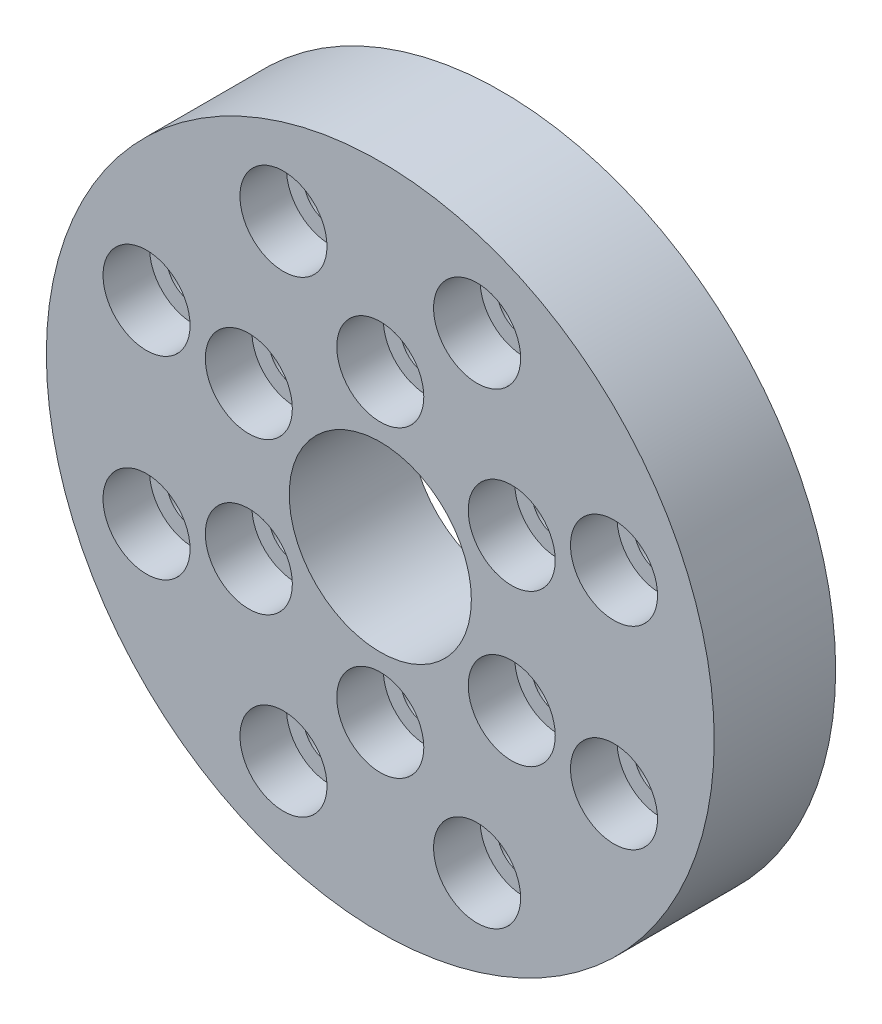
ISO-10303-21;
HEADER;
FILE_DESCRIPTION(('STEP AP214'),'2;1');
FILE_NAME('part.step','',(''),(''),'','','');
FILE_SCHEMA(('AUTOMOTIVE_DESIGN { 1 0 10303 214 1 1 1 1 }'));
ENDSEC;
DATA;
#1=APPLICATION_CONTEXT('core data for automotive mechanical design processes');
#2=APPLICATION_PROTOCOL_DEFINITION('international standard','automotive_design',2000,#1);
#3=PRODUCT_CONTEXT('',#1,'mechanical');
#4=PRODUCT('Part','Part','',(#3));
#5=PRODUCT_RELATED_PRODUCT_CATEGORY('part','',(#4));
#6=PRODUCT_DEFINITION_FORMATION('','',#4);
#7=PRODUCT_DEFINITION_CONTEXT('part definition',#1,'design');
#8=PRODUCT_DEFINITION('design','',#6,#7);
#9=PRODUCT_DEFINITION_SHAPE('','',#8);
#10=(LENGTH_UNIT() NAMED_UNIT(*) SI_UNIT(.MILLI.,.METRE.));
#11=(NAMED_UNIT(*) PLANE_ANGLE_UNIT() SI_UNIT($,.RADIAN.));
#12=(NAMED_UNIT(*) SI_UNIT($,.STERADIAN.) SOLID_ANGLE_UNIT());
#13=UNCERTAINTY_MEASURE_WITH_UNIT(LENGTH_MEASURE(1.E-05),#10,'distance_accuracy_value','');
#14=(GEOMETRIC_REPRESENTATION_CONTEXT(3) GLOBAL_UNCERTAINTY_ASSIGNED_CONTEXT((#13)) GLOBAL_UNIT_ASSIGNED_CONTEXT((#10,
#11,#12)) REPRESENTATION_CONTEXT('',''));
#15=CARTESIAN_POINT('',(0.,0.,0.));
#16=DIRECTION('',(0.,0.,1.));
#17=DIRECTION('',(1.,0.,0.));
#18=AXIS2_PLACEMENT_3D('',#15,#16,#17);
#19=CARTESIAN_POINT('',(0.,0.,6.));
#20=DIRECTION('',(0.,0.,1.));
#21=DIRECTION('',(1.,0.,0.));
#22=AXIS2_PLACEMENT_3D('',#19,#20,#21);
#23=PLANE('',#22);
#24=CARTESIAN_POINT('',(-11.548494156391,4.78354290456375,6.));
#25=DIRECTION('',(0.,0.,1.));
#26=DIRECTION('',(1.,0.,0.));
#27=AXIS2_PLACEMENT_3D('',#24,#25,#26);
#28=CIRCLE('',#27,2.15);
#29=CARTESIAN_POINT('',(-9.39849415639103,4.78354290456375,6.));
#30=VERTEX_POINT('',#29);
#31=EDGE_CURVE('E216',#30,#30,#28,.T.);
#32=ORIENTED_EDGE('',*,*,#31,.F.);
#33=EDGE_LOOP('',(#32));
#34=FACE_BOUND('',#33,.T.);
#35=CARTESIAN_POINT('',(-11.5484941563911,-4.78354290456351,6.));
#36=DIRECTION('',(0.,0.,1.));
#37=DIRECTION('',(1.,0.,0.));
#38=AXIS2_PLACEMENT_3D('',#35,#36,#37);
#39=CIRCLE('',#38,2.15);
#40=CARTESIAN_POINT('',(-9.39849415639114,-4.78354290456351,6.));
#41=VERTEX_POINT('',#40);
#42=EDGE_CURVE('E204',#41,#41,#39,.T.);
#43=ORIENTED_EDGE('',*,*,#42,.F.);
#44=EDGE_LOOP('',(#43));
#45=FACE_BOUND('',#44,.T.);
#46=CARTESIAN_POINT('',(-4.78354290456372,-11.548494156391,6.));
#47=DIRECTION('',(0.,0.,1.));
#48=DIRECTION('',(1.,0.,0.));
#49=AXIS2_PLACEMENT_3D('',#46,#47,#48);
#50=CIRCLE('',#49,2.15);
#51=CARTESIAN_POINT('',(-2.63354290456372,-11.548494156391,6.));
#52=VERTEX_POINT('',#51);
#53=EDGE_CURVE('E192',#52,#52,#50,.T.);
#54=ORIENTED_EDGE('',*,*,#53,.F.);
#55=EDGE_LOOP('',(#54));
#56=FACE_BOUND('',#55,.T.);
#57=CARTESIAN_POINT('',(4.78354290456363,-11.5484941563911,6.));
#58=DIRECTION('',(0.,0.,1.));
#59=DIRECTION('',(1.,0.,0.));
#60=AXIS2_PLACEMENT_3D('',#57,#58,#59);
#61=CIRCLE('',#60,2.15);
#62=CARTESIAN_POINT('',(6.93354290456363,-11.5484941563911,6.));
#63=VERTEX_POINT('',#62);
#64=EDGE_CURVE('E180',#63,#63,#61,.T.);
#65=ORIENTED_EDGE('',*,*,#64,.F.);
#66=EDGE_LOOP('',(#65));
#67=FACE_BOUND('',#66,.T.);
#68=CARTESIAN_POINT('',(11.5484941563911,-4.78354290456367,6.));
#69=DIRECTION('',(0.,0.,1.));
#70=DIRECTION('',(1.,0.,0.));
#71=AXIS2_PLACEMENT_3D('',#68,#69,#70);
#72=CIRCLE('',#71,2.15);
#73=CARTESIAN_POINT('',(13.6984941563911,-4.78354290456367,6.));
#74=VERTEX_POINT('',#73);
#75=EDGE_CURVE('E168',#74,#74,#72,.T.);
#76=ORIENTED_EDGE('',*,*,#75,.F.);
#77=EDGE_LOOP('',(#76));
#78=FACE_BOUND('',#77,.T.);
#79=CARTESIAN_POINT('',(11.5484941563911,4.78354290456359,6.));
#80=DIRECTION('',(0.,0.,1.));
#81=DIRECTION('',(1.,0.,0.));
#82=AXIS2_PLACEMENT_3D('',#79,#80,#81);
#83=CIRCLE('',#82,2.15);
#84=CARTESIAN_POINT('',(13.6984941563911,4.78354290456359,6.));
#85=VERTEX_POINT('',#84);
#86=EDGE_CURVE('E156',#85,#85,#83,.T.);
#87=ORIENTED_EDGE('',*,*,#86,.F.);
#88=EDGE_LOOP('',(#87));
#89=FACE_BOUND('',#88,.T.);
#90=CARTESIAN_POINT('',(4.78354290456363,11.5484941563911,6.));
#91=DIRECTION('',(0.,0.,1.));
#92=DIRECTION('',(1.,0.,0.));
#93=AXIS2_PLACEMENT_3D('',#90,#91,#92);
#94=CIRCLE('',#93,2.15);
#95=CARTESIAN_POINT('',(6.93354290456363,11.5484941563911,6.));
#96=VERTEX_POINT('',#95);
#97=EDGE_CURVE('E144',#96,#96,#94,.T.);
#98=ORIENTED_EDGE('',*,*,#97,.F.);
#99=EDGE_LOOP('',(#98));
#100=FACE_BOUND('',#99,.T.);
#101=CARTESIAN_POINT('',(-4.78354290456363,11.5484941563911,6.));
#102=DIRECTION('',(0.,0.,1.));
#103=DIRECTION('',(1.,0.,0.));
#104=AXIS2_PLACEMENT_3D('',#101,#102,#103);
#105=CIRCLE('',#104,2.15);
#106=CARTESIAN_POINT('',(-2.63354290456363,11.5484941563911,6.));
#107=VERTEX_POINT('',#106);
#108=EDGE_CURVE('E132',#107,#107,#105,.T.);
#109=ORIENTED_EDGE('',*,*,#108,.F.);
#110=EDGE_LOOP('',(#109));
#111=FACE_BOUND('',#110,.T.);
#112=CARTESIAN_POINT('',(-6.49519052838325,3.75000000000008,6.));
#113=DIRECTION('',(0.,0.,1.));
#114=DIRECTION('',(1.,0.,0.));
#115=AXIS2_PLACEMENT_3D('',#112,#113,#114);
#116=CIRCLE('',#115,2.15);
#117=CARTESIAN_POINT('',(-4.34519052838325,3.75000000000008,6.));
#118=VERTEX_POINT('',#117);
#119=EDGE_CURVE('E120',#118,#118,#116,.T.);
#120=ORIENTED_EDGE('',*,*,#119,.F.);
#121=EDGE_LOOP('',(#120));
#122=FACE_BOUND('',#121,.T.);
#123=CARTESIAN_POINT('',(-6.49519052838332,-3.74999999999994,6.));
#124=DIRECTION('',(0.,0.,1.));
#125=DIRECTION('',(1.,0.,0.));
#126=AXIS2_PLACEMENT_3D('',#123,#124,#125);
#127=CIRCLE('',#126,2.15);
#128=CARTESIAN_POINT('',(-4.34519052838332,-3.74999999999994,6.));
#129=VERTEX_POINT('',#128);
#130=EDGE_CURVE('E108',#129,#129,#127,.T.);
#131=ORIENTED_EDGE('',*,*,#130,.F.);
#132=EDGE_LOOP('',(#131));
#133=FACE_BOUND('',#132,.T.);
#134=CARTESIAN_POINT('',(0.,-7.5,6.));
#135=DIRECTION('',(0.,0.,1.));
#136=DIRECTION('',(1.,0.,0.));
#137=AXIS2_PLACEMENT_3D('',#134,#135,#136);
#138=CIRCLE('',#137,2.15);
#139=CARTESIAN_POINT('',(2.15,-7.5,6.));
#140=VERTEX_POINT('',#139);
#141=EDGE_CURVE('E96',#140,#140,#138,.T.);
#142=ORIENTED_EDGE('',*,*,#141,.F.);
#143=EDGE_LOOP('',(#142));
#144=FACE_BOUND('',#143,.T.);
#145=CARTESIAN_POINT('',(6.49519052838327,-3.75000000000003,6.));
#146=DIRECTION('',(0.,0.,1.));
#147=DIRECTION('',(1.,0.,0.));
#148=AXIS2_PLACEMENT_3D('',#145,#146,#147);
#149=CIRCLE('',#148,2.15);
#150=CARTESIAN_POINT('',(8.64519052838327,-3.75000000000003,6.));
#151=VERTEX_POINT('',#150);
#152=EDGE_CURVE('E84',#151,#151,#149,.T.);
#153=ORIENTED_EDGE('',*,*,#152,.F.);
#154=EDGE_LOOP('',(#153));
#155=FACE_BOUND('',#154,.T.);
#156=CARTESIAN_POINT('',(6.4951905283833,3.74999999999998,6.));
#157=DIRECTION('',(0.,0.,1.));
#158=DIRECTION('',(1.,0.,0.));
#159=AXIS2_PLACEMENT_3D('',#156,#157,#158);
#160=CIRCLE('',#159,2.15);
#161=CARTESIAN_POINT('',(8.6451905283833,3.74999999999998,6.));
#162=VERTEX_POINT('',#161);
#163=EDGE_CURVE('E72',#162,#162,#160,.T.);
#164=ORIENTED_EDGE('',*,*,#163,.F.);
#165=EDGE_LOOP('',(#164));
#166=FACE_BOUND('',#165,.T.);
#167=CARTESIAN_POINT('',(0.,7.5,6.));
#168=DIRECTION('',(0.,0.,1.));
#169=DIRECTION('',(1.,0.,0.));
#170=AXIS2_PLACEMENT_3D('',#167,#168,#169);
#171=CIRCLE('',#170,2.15);
#172=CARTESIAN_POINT('',(2.15,7.5,6.));
#173=VERTEX_POINT('',#172);
#174=EDGE_CURVE('E60',#173,#173,#171,.T.);
#175=ORIENTED_EDGE('',*,*,#174,.F.);
#176=EDGE_LOOP('',(#175));
#177=FACE_BOUND('',#176,.T.);
#178=CARTESIAN_POINT('',(0.,0.,6.));
#179=DIRECTION('',(0.,0.,1.));
#180=DIRECTION('',(1.,0.,0.));
#181=AXIS2_PLACEMENT_3D('',#178,#179,#180);
#182=CIRCLE('',#181,16.5);
#183=CARTESIAN_POINT('',(16.5,0.,6.));
#184=VERTEX_POINT('',#183);
#185=EDGE_CURVE('E10',#184,#184,#182,.T.);
#186=ORIENTED_EDGE('',*,*,#185,.T.);
#187=EDGE_LOOP('',(#186));
#188=FACE_BOUND('',#187,.T.);
#189=CARTESIAN_POINT('',(0.,0.,6.));
#190=DIRECTION('',(0.,0.,1.));
#191=DIRECTION('',(1.,0.,0.));
#192=AXIS2_PLACEMENT_3D('',#189,#190,#191);
#193=CIRCLE('',#192,4.5);
#194=CARTESIAN_POINT('',(4.5,0.,6.));
#195=VERTEX_POINT('',#194);
#196=EDGE_CURVE('E44',#195,#195,#193,.T.);
#197=ORIENTED_EDGE('',*,*,#196,.F.);
#198=EDGE_LOOP('',(#197));
#199=FACE_BOUND('',#198,.T.);
#200=ADVANCED_FACE('F33',(#34,#45,#56,#67,#78,#89,#100,#111,#122,#133,#144,#155,#166,#177,#188,
#199),#23,.T.);
#201=CARTESIAN_POINT('',(0.,0.,0.));
#202=DIRECTION('',(0.,0.,1.));
#203=DIRECTION('',(1.,0.,0.));
#204=AXIS2_PLACEMENT_3D('',#201,#202,#203);
#205=PLANE('',#204);
#206=CARTESIAN_POINT('',(-11.548494156391,4.78354290456375,0.));
#207=DIRECTION('',(0.,0.,1.));
#208=DIRECTION('',(1.,0.,0.));
#209=AXIS2_PLACEMENT_3D('',#206,#207,#208);
#210=CIRCLE('',#209,1.3);
#211=CARTESIAN_POINT('',(-10.248494156391,4.78354290456375,0.));
#212=VERTEX_POINT('',#211);
#213=EDGE_CURVE('E207',#212,#212,#210,.T.);
#214=ORIENTED_EDGE('',*,*,#213,.T.);
#215=EDGE_LOOP('',(#214));
#216=FACE_BOUND('',#215,.T.);
#217=CARTESIAN_POINT('',(-11.5484941563911,-4.78354290456351,0.));
#218=DIRECTION('',(0.,0.,1.));
#219=DIRECTION('',(1.,0.,0.));
#220=AXIS2_PLACEMENT_3D('',#217,#218,#219);
#221=CIRCLE('',#220,1.3);
#222=CARTESIAN_POINT('',(-10.2484941563911,-4.78354290456351,0.));
#223=VERTEX_POINT('',#222);
#224=EDGE_CURVE('E195',#223,#223,#221,.T.);
#225=ORIENTED_EDGE('',*,*,#224,.T.);
#226=EDGE_LOOP('',(#225));
#227=FACE_BOUND('',#226,.T.);
#228=CARTESIAN_POINT('',(-4.78354290456372,-11.548494156391,0.));
#229=DIRECTION('',(0.,0.,1.));
#230=DIRECTION('',(1.,0.,0.));
#231=AXIS2_PLACEMENT_3D('',#228,#229,#230);
#232=CIRCLE('',#231,1.3);
#233=CARTESIAN_POINT('',(-3.48354290456372,-11.548494156391,0.));
#234=VERTEX_POINT('',#233);
#235=EDGE_CURVE('E183',#234,#234,#232,.T.);
#236=ORIENTED_EDGE('',*,*,#235,.T.);
#237=EDGE_LOOP('',(#236));
#238=FACE_BOUND('',#237,.T.);
#239=CARTESIAN_POINT('',(4.78354290456363,-11.5484941563911,0.));
#240=DIRECTION('',(0.,0.,1.));
#241=DIRECTION('',(1.,0.,0.));
#242=AXIS2_PLACEMENT_3D('',#239,#240,#241);
#243=CIRCLE('',#242,1.3);
#244=CARTESIAN_POINT('',(6.08354290456363,-11.5484941563911,0.));
#245=VERTEX_POINT('',#244);
#246=EDGE_CURVE('E171',#245,#245,#243,.T.);
#247=ORIENTED_EDGE('',*,*,#246,.T.);
#248=EDGE_LOOP('',(#247));
#249=FACE_BOUND('',#248,.T.);
#250=CARTESIAN_POINT('',(11.5484941563911,-4.78354290456367,0.));
#251=DIRECTION('',(0.,0.,1.));
#252=DIRECTION('',(1.,0.,0.));
#253=AXIS2_PLACEMENT_3D('',#250,#251,#252);
#254=CIRCLE('',#253,1.3);
#255=CARTESIAN_POINT('',(12.8484941563911,-4.78354290456367,0.));
#256=VERTEX_POINT('',#255);
#257=EDGE_CURVE('E159',#256,#256,#254,.T.);
#258=ORIENTED_EDGE('',*,*,#257,.T.);
#259=EDGE_LOOP('',(#258));
#260=FACE_BOUND('',#259,.T.);
#261=CARTESIAN_POINT('',(11.5484941563911,4.78354290456359,0.));
#262=DIRECTION('',(0.,0.,1.));
#263=DIRECTION('',(1.,0.,0.));
#264=AXIS2_PLACEMENT_3D('',#261,#262,#263);
#265=CIRCLE('',#264,1.3);
#266=CARTESIAN_POINT('',(12.8484941563911,4.78354290456359,0.));
#267=VERTEX_POINT('',#266);
#268=EDGE_CURVE('E147',#267,#267,#265,.T.);
#269=ORIENTED_EDGE('',*,*,#268,.T.);
#270=EDGE_LOOP('',(#269));
#271=FACE_BOUND('',#270,.T.);
#272=CARTESIAN_POINT('',(4.78354290456363,11.5484941563911,0.));
#273=DIRECTION('',(0.,0.,1.));
#274=DIRECTION('',(1.,0.,0.));
#275=AXIS2_PLACEMENT_3D('',#272,#273,#274);
#276=CIRCLE('',#275,1.3);
#277=CARTESIAN_POINT('',(6.08354290456363,11.5484941563911,0.));
#278=VERTEX_POINT('',#277);
#279=EDGE_CURVE('E135',#278,#278,#276,.T.);
#280=ORIENTED_EDGE('',*,*,#279,.T.);
#281=EDGE_LOOP('',(#280));
#282=FACE_BOUND('',#281,.T.);
#283=CARTESIAN_POINT('',(-4.78354290456363,11.5484941563911,0.));
#284=DIRECTION('',(0.,0.,1.));
#285=DIRECTION('',(1.,0.,0.));
#286=AXIS2_PLACEMENT_3D('',#283,#284,#285);
#287=CIRCLE('',#286,1.3);
#288=CARTESIAN_POINT('',(-3.48354290456363,11.5484941563911,0.));
#289=VERTEX_POINT('',#288);
#290=EDGE_CURVE('E123',#289,#289,#287,.T.);
#291=ORIENTED_EDGE('',*,*,#290,.T.);
#292=EDGE_LOOP('',(#291));
#293=FACE_BOUND('',#292,.T.);
#294=CARTESIAN_POINT('',(-6.49519052838325,3.75000000000008,0.));
#295=DIRECTION('',(0.,0.,1.));
#296=DIRECTION('',(1.,0.,0.));
#297=AXIS2_PLACEMENT_3D('',#294,#295,#296);
#298=CIRCLE('',#297,1.3);
#299=CARTESIAN_POINT('',(-5.19519052838325,3.75000000000008,0.));
#300=VERTEX_POINT('',#299);
#301=EDGE_CURVE('E111',#300,#300,#298,.T.);
#302=ORIENTED_EDGE('',*,*,#301,.T.);
#303=EDGE_LOOP('',(#302));
#304=FACE_BOUND('',#303,.T.);
#305=CARTESIAN_POINT('',(-6.49519052838332,-3.74999999999994,0.));
#306=DIRECTION('',(0.,0.,1.));
#307=DIRECTION('',(1.,0.,0.));
#308=AXIS2_PLACEMENT_3D('',#305,#306,#307);
#309=CIRCLE('',#308,1.3);
#310=CARTESIAN_POINT('',(-5.19519052838333,-3.74999999999994,0.));
#311=VERTEX_POINT('',#310);
#312=EDGE_CURVE('E99',#311,#311,#309,.T.);
#313=ORIENTED_EDGE('',*,*,#312,.T.);
#314=EDGE_LOOP('',(#313));
#315=FACE_BOUND('',#314,.T.);
#316=CARTESIAN_POINT('',(0.,-7.5,0.));
#317=DIRECTION('',(0.,0.,1.));
#318=DIRECTION('',(1.,0.,0.));
#319=AXIS2_PLACEMENT_3D('',#316,#317,#318);
#320=CIRCLE('',#319,1.3);
#321=CARTESIAN_POINT('',(1.3,-7.5,0.));
#322=VERTEX_POINT('',#321);
#323=EDGE_CURVE('E87',#322,#322,#320,.T.);
#324=ORIENTED_EDGE('',*,*,#323,.T.);
#325=EDGE_LOOP('',(#324));
#326=FACE_BOUND('',#325,.T.);
#327=CARTESIAN_POINT('',(6.49519052838327,-3.75000000000003,0.));
#328=DIRECTION('',(0.,0.,1.));
#329=DIRECTION('',(1.,0.,0.));
#330=AXIS2_PLACEMENT_3D('',#327,#328,#329);
#331=CIRCLE('',#330,1.3);
#332=CARTESIAN_POINT('',(7.79519052838327,-3.75000000000003,0.));
#333=VERTEX_POINT('',#332);
#334=EDGE_CURVE('E75',#333,#333,#331,.T.);
#335=ORIENTED_EDGE('',*,*,#334,.T.);
#336=EDGE_LOOP('',(#335));
#337=FACE_BOUND('',#336,.T.);
#338=CARTESIAN_POINT('',(6.4951905283833,3.74999999999998,0.));
#339=DIRECTION('',(0.,0.,1.));
#340=DIRECTION('',(1.,0.,0.));
#341=AXIS2_PLACEMENT_3D('',#338,#339,#340);
#342=CIRCLE('',#341,1.3);
#343=CARTESIAN_POINT('',(7.7951905283833,3.74999999999998,0.));
#344=VERTEX_POINT('',#343);
#345=EDGE_CURVE('E63',#344,#344,#342,.T.);
#346=ORIENTED_EDGE('',*,*,#345,.T.);
#347=EDGE_LOOP('',(#346));
#348=FACE_BOUND('',#347,.T.);
#349=CARTESIAN_POINT('',(0.,7.5,0.));
#350=DIRECTION('',(0.,0.,1.));
#351=DIRECTION('',(1.,0.,0.));
#352=AXIS2_PLACEMENT_3D('',#349,#350,#351);
#353=CIRCLE('',#352,1.3);
#354=CARTESIAN_POINT('',(1.3,7.5,0.));
#355=VERTEX_POINT('',#354);
#356=EDGE_CURVE('E49',#355,#355,#353,.T.);
#357=ORIENTED_EDGE('',*,*,#356,.T.);
#358=EDGE_LOOP('',(#357));
#359=FACE_BOUND('',#358,.T.);
#360=CARTESIAN_POINT('',(0.,0.,0.));
#361=DIRECTION('',(0.,0.,1.));
#362=DIRECTION('',(1.,0.,0.));
#363=AXIS2_PLACEMENT_3D('',#360,#361,#362);
#364=CIRCLE('',#363,16.5);
#365=CARTESIAN_POINT('',(16.5,0.,0.));
#366=VERTEX_POINT('',#365);
#367=EDGE_CURVE('E37',#366,#366,#364,.T.);
#368=ORIENTED_EDGE('',*,*,#367,.F.);
#369=EDGE_LOOP('',(#368));
#370=FACE_BOUND('',#369,.T.);
#371=CARTESIAN_POINT('',(0.,0.,0.));
#372=DIRECTION('',(0.,0.,1.));
#373=DIRECTION('',(1.,0.,0.));
#374=AXIS2_PLACEMENT_3D('',#371,#372,#373);
#375=CIRCLE('',#374,4.5);
#376=CARTESIAN_POINT('',(4.5,0.,0.));
#377=VERTEX_POINT('',#376);
#378=EDGE_CURVE('E46',#377,#377,#375,.T.);
#379=ORIENTED_EDGE('',*,*,#378,.T.);
#380=EDGE_LOOP('',(#379));
#381=FACE_BOUND('',#380,.T.);
#382=ADVANCED_FACE('F224',(#216,#227,#238,#249,#260,#271,#282,#293,#304,#315,#326,#337,#348,
#359,#370,#381),#205,.F.);
#383=CARTESIAN_POINT('',(0.,0.,6.));
#384=DIRECTION('',(0.,0.,-1.));
#385=DIRECTION('',(-1.,0.,0.));
#386=AXIS2_PLACEMENT_3D('',#383,#384,#385);
#387=CYLINDRICAL_SURFACE('',#386,16.5);
#388=ORIENTED_EDGE('',*,*,#185,.F.);
#389=EDGE_LOOP('',(#388));
#390=FACE_BOUND('',#389,.T.);
#391=ORIENTED_EDGE('',*,*,#367,.T.);
#392=EDGE_LOOP('',(#391));
#393=FACE_BOUND('',#392,.T.);
#394=ADVANCED_FACE('F35',(#390,#393),#387,.T.);
#395=CARTESIAN_POINT('',(0.,0.,6.));
#396=DIRECTION('',(0.,0.,-1.));
#397=DIRECTION('',(-1.,0.,0.));
#398=AXIS2_PLACEMENT_3D('',#395,#396,#397);
#399=CYLINDRICAL_SURFACE('',#398,4.5);
#400=ORIENTED_EDGE('',*,*,#196,.T.);
#401=EDGE_LOOP('',(#400));
#402=FACE_BOUND('',#401,.T.);
#403=ORIENTED_EDGE('',*,*,#378,.F.);
#404=EDGE_LOOP('',(#403));
#405=FACE_BOUND('',#404,.T.);
#406=ADVANCED_FACE('F254',(#402,#405),#399,.F.);
#407=CARTESIAN_POINT('',(0.,7.5,6.));
#408=DIRECTION('',(0.,0.,1.));
#409=DIRECTION('',(1.,0.,0.));
#410=AXIS2_PLACEMENT_3D('',#407,#408,#409);
#411=CYLINDRICAL_SURFACE('',#410,1.3);
#412=ORIENTED_EDGE('',*,*,#356,.F.);
#413=EDGE_LOOP('',(#412));
#414=FACE_BOUND('',#413,.T.);
#415=CARTESIAN_POINT('',(0.,7.5,3.7));
#416=DIRECTION('',(0.,0.,1.));
#417=DIRECTION('',(1.,0.,0.));
#418=AXIS2_PLACEMENT_3D('',#415,#416,#417);
#419=CIRCLE('',#418,1.3);
#420=CARTESIAN_POINT('',(1.3,7.5,3.7));
#421=VERTEX_POINT('',#420);
#422=EDGE_CURVE('E54',#421,#421,#419,.T.);
#423=ORIENTED_EDGE('',*,*,#422,.T.);
#424=EDGE_LOOP('',(#423));
#425=FACE_BOUND('',#424,.T.);
#426=ADVANCED_FACE('F257',(#414,#425),#411,.F.);
#427=CARTESIAN_POINT('',(1.3,7.5,3.7));
#428=DIRECTION('',(0.,0.,-1.));
#429=DIRECTION('',(-1.,0.,0.));
#430=AXIS2_PLACEMENT_3D('',#427,#428,#429);
#431=PLANE('',#430);
#432=ORIENTED_EDGE('',*,*,#422,.F.);
#433=EDGE_LOOP('',(#432));
#434=FACE_BOUND('',#433,.T.);
#435=CARTESIAN_POINT('',(0.,7.5,3.7));
#436=DIRECTION('',(0.,0.,1.));
#437=DIRECTION('',(1.,0.,0.));
#438=AXIS2_PLACEMENT_3D('',#435,#436,#437);
#439=CIRCLE('',#438,2.15);
#440=CARTESIAN_POINT('',(2.15,7.5,3.7));
#441=VERTEX_POINT('',#440);
#442=EDGE_CURVE('E57',#441,#441,#439,.T.);
#443=ORIENTED_EDGE('',*,*,#442,.T.);
#444=EDGE_LOOP('',(#443));
#445=FACE_BOUND('',#444,.T.);
#446=ADVANCED_FACE('F271',(#434,#445),#431,.F.);
#447=CARTESIAN_POINT('',(0.,7.5,6.));
#448=DIRECTION('',(0.,0.,1.));
#449=DIRECTION('',(1.,0.,0.));
#450=AXIS2_PLACEMENT_3D('',#447,#448,#449);
#451=CYLINDRICAL_SURFACE('',#450,2.15);
#452=ORIENTED_EDGE('',*,*,#442,.F.);
#453=EDGE_LOOP('',(#452));
#454=FACE_BOUND('',#453,.T.);
#455=ORIENTED_EDGE('',*,*,#174,.T.);
#456=EDGE_LOOP('',(#455));
#457=FACE_BOUND('',#456,.T.);
#458=ADVANCED_FACE('F275',(#454,#457),#451,.F.);
#459=CARTESIAN_POINT('',(6.4951905283833,3.74999999999998,6.));
#460=DIRECTION('',(0.,0.,1.));
#461=DIRECTION('',(1.,0.,0.));
#462=AXIS2_PLACEMENT_3D('',#459,#460,#461);
#463=CYLINDRICAL_SURFACE('',#462,1.3);
#464=ORIENTED_EDGE('',*,*,#345,.F.);
#465=EDGE_LOOP('',(#464));
#466=FACE_BOUND('',#465,.T.);
#467=CARTESIAN_POINT('',(6.4951905283833,3.74999999999998,3.7));
#468=DIRECTION('',(0.,0.,1.));
#469=DIRECTION('',(1.,0.,0.));
#470=AXIS2_PLACEMENT_3D('',#467,#468,#469);
#471=CIRCLE('',#470,1.3);
#472=CARTESIAN_POINT('',(7.7951905283833,3.74999999999998,3.7));
#473=VERTEX_POINT('',#472);
#474=EDGE_CURVE('E66',#473,#473,#471,.T.);
#475=ORIENTED_EDGE('',*,*,#474,.T.);
#476=EDGE_LOOP('',(#475));
#477=FACE_BOUND('',#476,.T.);
#478=ADVANCED_FACE('F279',(#466,#477),#463,.F.);
#479=CARTESIAN_POINT('',(7.7951905283833,3.74999999999998,3.7));
#480=DIRECTION('',(0.,0.,-1.));
#481=DIRECTION('',(-1.,0.,0.));
#482=AXIS2_PLACEMENT_3D('',#479,#480,#481);
#483=PLANE('',#482);
#484=ORIENTED_EDGE('',*,*,#474,.F.);
#485=EDGE_LOOP('',(#484));
#486=FACE_BOUND('',#485,.T.);
#487=CARTESIAN_POINT('',(6.4951905283833,3.74999999999998,3.7));
#488=DIRECTION('',(0.,0.,1.));
#489=DIRECTION('',(1.,0.,0.));
#490=AXIS2_PLACEMENT_3D('',#487,#488,#489);
#491=CIRCLE('',#490,2.15);
#492=CARTESIAN_POINT('',(8.6451905283833,3.74999999999998,3.7));
#493=VERTEX_POINT('',#492);
#494=EDGE_CURVE('E69',#493,#493,#491,.T.);
#495=ORIENTED_EDGE('',*,*,#494,.T.);
#496=EDGE_LOOP('',(#495));
#497=FACE_BOUND('',#496,.T.);
#498=ADVANCED_FACE('F283',(#486,#497),#483,.F.);
#499=CARTESIAN_POINT('',(6.4951905283833,3.74999999999998,6.));
#500=DIRECTION('',(0.,0.,1.));
#501=DIRECTION('',(1.,0.,0.));
#502=AXIS2_PLACEMENT_3D('',#499,#500,#501);
#503=CYLINDRICAL_SURFACE('',#502,2.15);
#504=ORIENTED_EDGE('',*,*,#494,.F.);
#505=EDGE_LOOP('',(#504));
#506=FACE_BOUND('',#505,.T.);
#507=ORIENTED_EDGE('',*,*,#163,.T.);
#508=EDGE_LOOP('',(#507));
#509=FACE_BOUND('',#508,.T.);
#510=ADVANCED_FACE('F287',(#506,#509),#503,.F.);
#511=CARTESIAN_POINT('',(6.49519052838327,-3.75000000000003,6.));
#512=DIRECTION('',(0.,0.,1.));
#513=DIRECTION('',(1.,0.,0.));
#514=AXIS2_PLACEMENT_3D('',#511,#512,#513);
#515=CYLINDRICAL_SURFACE('',#514,1.3);
#516=ORIENTED_EDGE('',*,*,#334,.F.);
#517=EDGE_LOOP('',(#516));
#518=FACE_BOUND('',#517,.T.);
#519=CARTESIAN_POINT('',(6.49519052838327,-3.75000000000003,3.7));
#520=DIRECTION('',(0.,0.,1.));
#521=DIRECTION('',(1.,0.,0.));
#522=AXIS2_PLACEMENT_3D('',#519,#520,#521);
#523=CIRCLE('',#522,1.3);
#524=CARTESIAN_POINT('',(7.79519052838327,-3.75000000000003,3.7));
#525=VERTEX_POINT('',#524);
#526=EDGE_CURVE('E78',#525,#525,#523,.T.);
#527=ORIENTED_EDGE('',*,*,#526,.T.);
#528=EDGE_LOOP('',(#527));
#529=FACE_BOUND('',#528,.T.);
#530=ADVANCED_FACE('F291',(#518,#529),#515,.F.);
#531=CARTESIAN_POINT('',(7.79519052838327,-3.75000000000003,3.7));
#532=DIRECTION('',(0.,0.,-1.));
#533=DIRECTION('',(-1.,0.,0.));
#534=AXIS2_PLACEMENT_3D('',#531,#532,#533);
#535=PLANE('',#534);
#536=ORIENTED_EDGE('',*,*,#526,.F.);
#537=EDGE_LOOP('',(#536));
#538=FACE_BOUND('',#537,.T.);
#539=CARTESIAN_POINT('',(6.49519052838327,-3.75000000000003,3.7));
#540=DIRECTION('',(0.,0.,1.));
#541=DIRECTION('',(1.,0.,0.));
#542=AXIS2_PLACEMENT_3D('',#539,#540,#541);
#543=CIRCLE('',#542,2.15);
#544=CARTESIAN_POINT('',(8.64519052838327,-3.75000000000003,3.7));
#545=VERTEX_POINT('',#544);
#546=EDGE_CURVE('E81',#545,#545,#543,.T.);
#547=ORIENTED_EDGE('',*,*,#546,.T.);
#548=EDGE_LOOP('',(#547));
#549=FACE_BOUND('',#548,.T.);
#550=ADVANCED_FACE('F295',(#538,#549),#535,.F.);
#551=CARTESIAN_POINT('',(6.49519052838327,-3.75000000000003,6.));
#552=DIRECTION('',(0.,0.,1.));
#553=DIRECTION('',(1.,0.,0.));
#554=AXIS2_PLACEMENT_3D('',#551,#552,#553);
#555=CYLINDRICAL_SURFACE('',#554,2.15);
#556=ORIENTED_EDGE('',*,*,#546,.F.);
#557=EDGE_LOOP('',(#556));
#558=FACE_BOUND('',#557,.T.);
#559=ORIENTED_EDGE('',*,*,#152,.T.);
#560=EDGE_LOOP('',(#559));
#561=FACE_BOUND('',#560,.T.);
#562=ADVANCED_FACE('F299',(#558,#561),#555,.F.);
#563=CARTESIAN_POINT('',(0.,-7.5,6.));
#564=DIRECTION('',(0.,0.,1.));
#565=DIRECTION('',(1.,0.,0.));
#566=AXIS2_PLACEMENT_3D('',#563,#564,#565);
#567=CYLINDRICAL_SURFACE('',#566,1.3);
#568=ORIENTED_EDGE('',*,*,#323,.F.);
#569=EDGE_LOOP('',(#568));
#570=FACE_BOUND('',#569,.T.);
#571=CARTESIAN_POINT('',(0.,-7.5,3.7));
#572=DIRECTION('',(0.,0.,1.));
#573=DIRECTION('',(1.,0.,0.));
#574=AXIS2_PLACEMENT_3D('',#571,#572,#573);
#575=CIRCLE('',#574,1.3);
#576=CARTESIAN_POINT('',(1.3,-7.5,3.7));
#577=VERTEX_POINT('',#576);
#578=EDGE_CURVE('E90',#577,#577,#575,.T.);
#579=ORIENTED_EDGE('',*,*,#578,.T.);
#580=EDGE_LOOP('',(#579));
#581=FACE_BOUND('',#580,.T.);
#582=ADVANCED_FACE('F303',(#570,#581),#567,.F.);
#583=CARTESIAN_POINT('',(1.3,-7.5,3.7));
#584=DIRECTION('',(0.,0.,-1.));
#585=DIRECTION('',(-1.,0.,0.));
#586=AXIS2_PLACEMENT_3D('',#583,#584,#585);
#587=PLANE('',#586);
#588=ORIENTED_EDGE('',*,*,#578,.F.);
#589=EDGE_LOOP('',(#588));
#590=FACE_BOUND('',#589,.T.);
#591=CARTESIAN_POINT('',(0.,-7.5,3.7));
#592=DIRECTION('',(0.,0.,1.));
#593=DIRECTION('',(1.,0.,0.));
#594=AXIS2_PLACEMENT_3D('',#591,#592,#593);
#595=CIRCLE('',#594,2.15);
#596=CARTESIAN_POINT('',(2.15,-7.5,3.7));
#597=VERTEX_POINT('',#596);
#598=EDGE_CURVE('E93',#597,#597,#595,.T.);
#599=ORIENTED_EDGE('',*,*,#598,.T.);
#600=EDGE_LOOP('',(#599));
#601=FACE_BOUND('',#600,.T.);
#602=ADVANCED_FACE('F307',(#590,#601),#587,.F.);
#603=CARTESIAN_POINT('',(0.,-7.5,6.));
#604=DIRECTION('',(0.,0.,1.));
#605=DIRECTION('',(1.,0.,0.));
#606=AXIS2_PLACEMENT_3D('',#603,#604,#605);
#607=CYLINDRICAL_SURFACE('',#606,2.15);
#608=ORIENTED_EDGE('',*,*,#598,.F.);
#609=EDGE_LOOP('',(#608));
#610=FACE_BOUND('',#609,.T.);
#611=ORIENTED_EDGE('',*,*,#141,.T.);
#612=EDGE_LOOP('',(#611));
#613=FACE_BOUND('',#612,.T.);
#614=ADVANCED_FACE('F311',(#610,#613),#607,.F.);
#615=CARTESIAN_POINT('',(-6.49519052838332,-3.74999999999994,6.));
#616=DIRECTION('',(0.,0.,1.));
#617=DIRECTION('',(1.,0.,0.));
#618=AXIS2_PLACEMENT_3D('',#615,#616,#617);
#619=CYLINDRICAL_SURFACE('',#618,1.3);
#620=ORIENTED_EDGE('',*,*,#312,.F.);
#621=EDGE_LOOP('',(#620));
#622=FACE_BOUND('',#621,.T.);
#623=CARTESIAN_POINT('',(-6.49519052838332,-3.74999999999994,3.7));
#624=DIRECTION('',(0.,0.,1.));
#625=DIRECTION('',(1.,0.,0.));
#626=AXIS2_PLACEMENT_3D('',#623,#624,#625);
#627=CIRCLE('',#626,1.3);
#628=CARTESIAN_POINT('',(-5.19519052838332,-3.74999999999994,3.7));
#629=VERTEX_POINT('',#628);
#630=EDGE_CURVE('E102',#629,#629,#627,.T.);
#631=ORIENTED_EDGE('',*,*,#630,.T.);
#632=EDGE_LOOP('',(#631));
#633=FACE_BOUND('',#632,.T.);
#634=ADVANCED_FACE('F315',(#622,#633),#619,.F.);
#635=CARTESIAN_POINT('',(-5.19519052838332,-3.74999999999994,3.7));
#636=DIRECTION('',(0.,0.,-1.));
#637=DIRECTION('',(-1.,0.,0.));
#638=AXIS2_PLACEMENT_3D('',#635,#636,#637);
#639=PLANE('',#638);
#640=ORIENTED_EDGE('',*,*,#630,.F.);
#641=EDGE_LOOP('',(#640));
#642=FACE_BOUND('',#641,.T.);
#643=CARTESIAN_POINT('',(-6.49519052838332,-3.74999999999994,3.7));
#644=DIRECTION('',(0.,0.,1.));
#645=DIRECTION('',(1.,0.,0.));
#646=AXIS2_PLACEMENT_3D('',#643,#644,#645);
#647=CIRCLE('',#646,2.15);
#648=CARTESIAN_POINT('',(-4.34519052838333,-3.74999999999994,3.7));
#649=VERTEX_POINT('',#648);
#650=EDGE_CURVE('E105',#649,#649,#647,.T.);
#651=ORIENTED_EDGE('',*,*,#650,.T.);
#652=EDGE_LOOP('',(#651));
#653=FACE_BOUND('',#652,.T.);
#654=ADVANCED_FACE('F319',(#642,#653),#639,.F.);
#655=CARTESIAN_POINT('',(-6.49519052838332,-3.74999999999994,6.));
#656=DIRECTION('',(0.,0.,1.));
#657=DIRECTION('',(1.,0.,0.));
#658=AXIS2_PLACEMENT_3D('',#655,#656,#657);
#659=CYLINDRICAL_SURFACE('',#658,2.15);
#660=ORIENTED_EDGE('',*,*,#650,.F.);
#661=EDGE_LOOP('',(#660));
#662=FACE_BOUND('',#661,.T.);
#663=ORIENTED_EDGE('',*,*,#130,.T.);
#664=EDGE_LOOP('',(#663));
#665=FACE_BOUND('',#664,.T.);
#666=ADVANCED_FACE('F323',(#662,#665),#659,.F.);
#667=CARTESIAN_POINT('',(-6.49519052838325,3.75000000000008,6.));
#668=DIRECTION('',(0.,0.,1.));
#669=DIRECTION('',(1.,0.,0.));
#670=AXIS2_PLACEMENT_3D('',#667,#668,#669);
#671=CYLINDRICAL_SURFACE('',#670,1.3);
#672=ORIENTED_EDGE('',*,*,#301,.F.);
#673=EDGE_LOOP('',(#672));
#674=FACE_BOUND('',#673,.T.);
#675=CARTESIAN_POINT('',(-6.49519052838325,3.75000000000008,3.7));
#676=DIRECTION('',(0.,0.,1.));
#677=DIRECTION('',(1.,0.,0.));
#678=AXIS2_PLACEMENT_3D('',#675,#676,#677);
#679=CIRCLE('',#678,1.3);
#680=CARTESIAN_POINT('',(-5.19519052838325,3.75000000000008,3.7));
#681=VERTEX_POINT('',#680);
#682=EDGE_CURVE('E114',#681,#681,#679,.T.);
#683=ORIENTED_EDGE('',*,*,#682,.T.);
#684=EDGE_LOOP('',(#683));
#685=FACE_BOUND('',#684,.T.);
#686=ADVANCED_FACE('F327',(#674,#685),#671,.F.);
#687=CARTESIAN_POINT('',(-5.19519052838325,3.75000000000008,3.7));
#688=DIRECTION('',(0.,0.,-1.));
#689=DIRECTION('',(-1.,0.,0.));
#690=AXIS2_PLACEMENT_3D('',#687,#688,#689);
#691=PLANE('',#690);
#692=ORIENTED_EDGE('',*,*,#682,.F.);
#693=EDGE_LOOP('',(#692));
#694=FACE_BOUND('',#693,.T.);
#695=CARTESIAN_POINT('',(-6.49519052838325,3.75000000000008,3.7));
#696=DIRECTION('',(0.,0.,1.));
#697=DIRECTION('',(1.,0.,0.));
#698=AXIS2_PLACEMENT_3D('',#695,#696,#697);
#699=CIRCLE('',#698,2.15);
#700=CARTESIAN_POINT('',(-4.34519052838325,3.75000000000008,3.7));
#701=VERTEX_POINT('',#700);
#702=EDGE_CURVE('E117',#701,#701,#699,.T.);
#703=ORIENTED_EDGE('',*,*,#702,.T.);
#704=EDGE_LOOP('',(#703));
#705=FACE_BOUND('',#704,.T.);
#706=ADVANCED_FACE('F331',(#694,#705),#691,.F.);
#707=CARTESIAN_POINT('',(-6.49519052838325,3.75000000000008,6.));
#708=DIRECTION('',(0.,0.,1.));
#709=DIRECTION('',(1.,0.,0.));
#710=AXIS2_PLACEMENT_3D('',#707,#708,#709);
#711=CYLINDRICAL_SURFACE('',#710,2.15);
#712=ORIENTED_EDGE('',*,*,#702,.F.);
#713=EDGE_LOOP('',(#712));
#714=FACE_BOUND('',#713,.T.);
#715=ORIENTED_EDGE('',*,*,#119,.T.);
#716=EDGE_LOOP('',(#715));
#717=FACE_BOUND('',#716,.T.);
#718=ADVANCED_FACE('F335',(#714,#717),#711,.F.);
#719=CARTESIAN_POINT('',(-4.78354290456363,11.5484941563911,6.));
#720=DIRECTION('',(0.,0.,1.));
#721=DIRECTION('',(1.,0.,0.));
#722=AXIS2_PLACEMENT_3D('',#719,#720,#721);
#723=CYLINDRICAL_SURFACE('',#722,1.3);
#724=ORIENTED_EDGE('',*,*,#290,.F.);
#725=EDGE_LOOP('',(#724));
#726=FACE_BOUND('',#725,.T.);
#727=CARTESIAN_POINT('',(-4.78354290456363,11.5484941563911,3.7));
#728=DIRECTION('',(0.,0.,1.));
#729=DIRECTION('',(1.,0.,0.));
#730=AXIS2_PLACEMENT_3D('',#727,#728,#729);
#731=CIRCLE('',#730,1.30000000000001);
#732=CARTESIAN_POINT('',(-3.48354290456362,11.5484941563911,3.7));
#733=VERTEX_POINT('',#732);
#734=EDGE_CURVE('E126',#733,#733,#731,.T.);
#735=ORIENTED_EDGE('',*,*,#734,.T.);
#736=EDGE_LOOP('',(#735));
#737=FACE_BOUND('',#736,.T.);
#738=ADVANCED_FACE('F339',(#726,#737),#723,.F.);
#739=CARTESIAN_POINT('',(-3.48354290456362,11.5484941563911,3.7));
#740=DIRECTION('',(0.,0.,-1.));
#741=DIRECTION('',(-1.,0.,0.));
#742=AXIS2_PLACEMENT_3D('',#739,#740,#741);
#743=PLANE('',#742);
#744=ORIENTED_EDGE('',*,*,#734,.F.);
#745=EDGE_LOOP('',(#744));
#746=FACE_BOUND('',#745,.T.);
#747=CARTESIAN_POINT('',(-4.78354290456363,11.5484941563911,3.7));
#748=DIRECTION('',(0.,0.,1.));
#749=DIRECTION('',(1.,0.,0.));
#750=AXIS2_PLACEMENT_3D('',#747,#748,#749);
#751=CIRCLE('',#750,2.15);
#752=CARTESIAN_POINT('',(-2.63354290456363,11.5484941563911,3.7));
#753=VERTEX_POINT('',#752);
#754=EDGE_CURVE('E129',#753,#753,#751,.T.);
#755=ORIENTED_EDGE('',*,*,#754,.T.);
#756=EDGE_LOOP('',(#755));
#757=FACE_BOUND('',#756,.T.);
#758=ADVANCED_FACE('F343',(#746,#757),#743,.F.);
#759=CARTESIAN_POINT('',(-4.78354290456363,11.5484941563911,6.));
#760=DIRECTION('',(0.,0.,1.));
#761=DIRECTION('',(1.,0.,0.));
#762=AXIS2_PLACEMENT_3D('',#759,#760,#761);
#763=CYLINDRICAL_SURFACE('',#762,2.15);
#764=ORIENTED_EDGE('',*,*,#754,.F.);
#765=EDGE_LOOP('',(#764));
#766=FACE_BOUND('',#765,.T.);
#767=ORIENTED_EDGE('',*,*,#108,.T.);
#768=EDGE_LOOP('',(#767));
#769=FACE_BOUND('',#768,.T.);
#770=ADVANCED_FACE('F347',(#766,#769),#763,.F.);
#771=CARTESIAN_POINT('',(4.78354290456363,11.5484941563911,6.));
#772=DIRECTION('',(0.,0.,1.));
#773=DIRECTION('',(1.,0.,0.));
#774=AXIS2_PLACEMENT_3D('',#771,#772,#773);
#775=CYLINDRICAL_SURFACE('',#774,1.30000000000001);
#776=ORIENTED_EDGE('',*,*,#279,.F.);
#777=EDGE_LOOP('',(#776));
#778=FACE_BOUND('',#777,.T.);
#779=CARTESIAN_POINT('',(4.78354290456363,11.5484941563911,3.7));
#780=DIRECTION('',(0.,0.,1.));
#781=DIRECTION('',(1.,0.,0.));
#782=AXIS2_PLACEMENT_3D('',#779,#780,#781);
#783=CIRCLE('',#782,1.30000000000001);
#784=CARTESIAN_POINT('',(6.08354290456364,11.5484941563911,3.7));
#785=VERTEX_POINT('',#784);
#786=EDGE_CURVE('E138',#785,#785,#783,.T.);
#787=ORIENTED_EDGE('',*,*,#786,.T.);
#788=EDGE_LOOP('',(#787));
#789=FACE_BOUND('',#788,.T.);
#790=ADVANCED_FACE('F351',(#778,#789),#775,.F.);
#791=CARTESIAN_POINT('',(6.08354290456364,11.5484941563911,3.7));
#792=DIRECTION('',(0.,0.,-1.));
#793=DIRECTION('',(-1.,0.,0.));
#794=AXIS2_PLACEMENT_3D('',#791,#792,#793);
#795=PLANE('',#794);
#796=ORIENTED_EDGE('',*,*,#786,.F.);
#797=EDGE_LOOP('',(#796));
#798=FACE_BOUND('',#797,.T.);
#799=CARTESIAN_POINT('',(4.78354290456363,11.5484941563911,3.7));
#800=DIRECTION('',(0.,0.,1.));
#801=DIRECTION('',(1.,0.,0.));
#802=AXIS2_PLACEMENT_3D('',#799,#800,#801);
#803=CIRCLE('',#802,2.15);
#804=CARTESIAN_POINT('',(6.93354290456363,11.5484941563911,3.7));
#805=VERTEX_POINT('',#804);
#806=EDGE_CURVE('E141',#805,#805,#803,.T.);
#807=ORIENTED_EDGE('',*,*,#806,.T.);
#808=EDGE_LOOP('',(#807));
#809=FACE_BOUND('',#808,.T.);
#810=ADVANCED_FACE('F355',(#798,#809),#795,.F.);
#811=CARTESIAN_POINT('',(4.78354290456363,11.5484941563911,6.));
#812=DIRECTION('',(0.,0.,1.));
#813=DIRECTION('',(1.,0.,0.));
#814=AXIS2_PLACEMENT_3D('',#811,#812,#813);
#815=CYLINDRICAL_SURFACE('',#814,2.15);
#816=ORIENTED_EDGE('',*,*,#806,.F.);
#817=EDGE_LOOP('',(#816));
#818=FACE_BOUND('',#817,.T.);
#819=ORIENTED_EDGE('',*,*,#97,.T.);
#820=EDGE_LOOP('',(#819));
#821=FACE_BOUND('',#820,.T.);
#822=ADVANCED_FACE('F359',(#818,#821),#815,.F.);
#823=CARTESIAN_POINT('',(11.5484941563911,4.78354290456359,6.));
#824=DIRECTION('',(0.,0.,1.));
#825=DIRECTION('',(1.,0.,0.));
#826=AXIS2_PLACEMENT_3D('',#823,#824,#825);
#827=CYLINDRICAL_SURFACE('',#826,1.30000000000001);
#828=ORIENTED_EDGE('',*,*,#268,.F.);
#829=EDGE_LOOP('',(#828));
#830=FACE_BOUND('',#829,.T.);
#831=CARTESIAN_POINT('',(11.5484941563911,4.78354290456359,3.7));
#832=DIRECTION('',(0.,0.,1.));
#833=DIRECTION('',(1.,0.,0.));
#834=AXIS2_PLACEMENT_3D('',#831,#832,#833);
#835=CIRCLE('',#834,1.30000000000001);
#836=CARTESIAN_POINT('',(12.8484941563911,4.78354290456359,3.7));
#837=VERTEX_POINT('',#836);
#838=EDGE_CURVE('E150',#837,#837,#835,.T.);
#839=ORIENTED_EDGE('',*,*,#838,.T.);
#840=EDGE_LOOP('',(#839));
#841=FACE_BOUND('',#840,.T.);
#842=ADVANCED_FACE('F363',(#830,#841),#827,.F.);
#843=CARTESIAN_POINT('',(12.8484941563911,4.78354290456359,3.7));
#844=DIRECTION('',(0.,0.,-1.));
#845=DIRECTION('',(-1.,0.,0.));
#846=AXIS2_PLACEMENT_3D('',#843,#844,#845);
#847=PLANE('',#846);
#848=ORIENTED_EDGE('',*,*,#838,.F.);
#849=EDGE_LOOP('',(#848));
#850=FACE_BOUND('',#849,.T.);
#851=CARTESIAN_POINT('',(11.5484941563911,4.78354290456359,3.7));
#852=DIRECTION('',(0.,0.,1.));
#853=DIRECTION('',(1.,0.,0.));
#854=AXIS2_PLACEMENT_3D('',#851,#852,#853);
#855=CIRCLE('',#854,2.15);
#856=CARTESIAN_POINT('',(13.6984941563911,4.78354290456359,3.7));
#857=VERTEX_POINT('',#856);
#858=EDGE_CURVE('E153',#857,#857,#855,.T.);
#859=ORIENTED_EDGE('',*,*,#858,.T.);
#860=EDGE_LOOP('',(#859));
#861=FACE_BOUND('',#860,.T.);
#862=ADVANCED_FACE('F367',(#850,#861),#847,.F.);
#863=CARTESIAN_POINT('',(11.5484941563911,4.78354290456359,6.));
#864=DIRECTION('',(0.,0.,1.));
#865=DIRECTION('',(1.,0.,0.));
#866=AXIS2_PLACEMENT_3D('',#863,#864,#865);
#867=CYLINDRICAL_SURFACE('',#866,2.15);
#868=ORIENTED_EDGE('',*,*,#858,.F.);
#869=EDGE_LOOP('',(#868));
#870=FACE_BOUND('',#869,.T.);
#871=ORIENTED_EDGE('',*,*,#86,.T.);
#872=EDGE_LOOP('',(#871));
#873=FACE_BOUND('',#872,.T.);
#874=ADVANCED_FACE('F371',(#870,#873),#867,.F.);
#875=CARTESIAN_POINT('',(11.5484941563911,-4.78354290456367,6.));
#876=DIRECTION('',(0.,0.,1.));
#877=DIRECTION('',(1.,0.,0.));
#878=AXIS2_PLACEMENT_3D('',#875,#876,#877);
#879=CYLINDRICAL_SURFACE('',#878,1.30000000000001);
#880=ORIENTED_EDGE('',*,*,#257,.F.);
#881=EDGE_LOOP('',(#880));
#882=FACE_BOUND('',#881,.T.);
#883=CARTESIAN_POINT('',(11.5484941563911,-4.78354290456367,3.7));
#884=DIRECTION('',(0.,0.,1.));
#885=DIRECTION('',(1.,0.,0.));
#886=AXIS2_PLACEMENT_3D('',#883,#884,#885);
#887=CIRCLE('',#886,1.30000000000001);
#888=CARTESIAN_POINT('',(12.8484941563911,-4.78354290456367,3.7));
#889=VERTEX_POINT('',#888);
#890=EDGE_CURVE('E162',#889,#889,#887,.T.);
#891=ORIENTED_EDGE('',*,*,#890,.T.);
#892=EDGE_LOOP('',(#891));
#893=FACE_BOUND('',#892,.T.);
#894=ADVANCED_FACE('F375',(#882,#893),#879,.F.);
#895=CARTESIAN_POINT('',(12.8484941563911,-4.78354290456367,3.7));
#896=DIRECTION('',(0.,0.,-1.));
#897=DIRECTION('',(-1.,0.,0.));
#898=AXIS2_PLACEMENT_3D('',#895,#896,#897);
#899=PLANE('',#898);
#900=ORIENTED_EDGE('',*,*,#890,.F.);
#901=EDGE_LOOP('',(#900));
#902=FACE_BOUND('',#901,.T.);
#903=CARTESIAN_POINT('',(11.5484941563911,-4.78354290456367,3.7));
#904=DIRECTION('',(0.,0.,1.));
#905=DIRECTION('',(1.,0.,0.));
#906=AXIS2_PLACEMENT_3D('',#903,#904,#905);
#907=CIRCLE('',#906,2.15);
#908=CARTESIAN_POINT('',(13.6984941563911,-4.78354290456367,3.7));
#909=VERTEX_POINT('',#908);
#910=EDGE_CURVE('E165',#909,#909,#907,.T.);
#911=ORIENTED_EDGE('',*,*,#910,.T.);
#912=EDGE_LOOP('',(#911));
#913=FACE_BOUND('',#912,.T.);
#914=ADVANCED_FACE('F379',(#902,#913),#899,.F.);
#915=CARTESIAN_POINT('',(11.5484941563911,-4.78354290456367,6.));
#916=DIRECTION('',(0.,0.,1.));
#917=DIRECTION('',(1.,0.,0.));
#918=AXIS2_PLACEMENT_3D('',#915,#916,#917);
#919=CYLINDRICAL_SURFACE('',#918,2.15);
#920=ORIENTED_EDGE('',*,*,#910,.F.);
#921=EDGE_LOOP('',(#920));
#922=FACE_BOUND('',#921,.T.);
#923=ORIENTED_EDGE('',*,*,#75,.T.);
#924=EDGE_LOOP('',(#923));
#925=FACE_BOUND('',#924,.T.);
#926=ADVANCED_FACE('F383',(#922,#925),#919,.F.);
#927=CARTESIAN_POINT('',(4.78354290456363,-11.5484941563911,6.));
#928=DIRECTION('',(0.,0.,1.));
#929=DIRECTION('',(1.,0.,0.));
#930=AXIS2_PLACEMENT_3D('',#927,#928,#929);
#931=CYLINDRICAL_SURFACE('',#930,1.30000000000001);
#932=ORIENTED_EDGE('',*,*,#246,.F.);
#933=EDGE_LOOP('',(#932));
#934=FACE_BOUND('',#933,.T.);
#935=CARTESIAN_POINT('',(4.78354290456363,-11.5484941563911,3.7));
#936=DIRECTION('',(0.,0.,1.));
#937=DIRECTION('',(1.,0.,0.));
#938=AXIS2_PLACEMENT_3D('',#935,#936,#937);
#939=CIRCLE('',#938,1.30000000000001);
#940=CARTESIAN_POINT('',(6.08354290456364,-11.5484941563911,3.7));
#941=VERTEX_POINT('',#940);
#942=EDGE_CURVE('E174',#941,#941,#939,.T.);
#943=ORIENTED_EDGE('',*,*,#942,.T.);
#944=EDGE_LOOP('',(#943));
#945=FACE_BOUND('',#944,.T.);
#946=ADVANCED_FACE('F387',(#934,#945),#931,.F.);
#947=CARTESIAN_POINT('',(6.08354290456364,-11.5484941563911,3.7));
#948=DIRECTION('',(0.,0.,-1.));
#949=DIRECTION('',(-1.,0.,0.));
#950=AXIS2_PLACEMENT_3D('',#947,#948,#949);
#951=PLANE('',#950);
#952=ORIENTED_EDGE('',*,*,#942,.F.);
#953=EDGE_LOOP('',(#952));
#954=FACE_BOUND('',#953,.T.);
#955=CARTESIAN_POINT('',(4.78354290456363,-11.5484941563911,3.7));
#956=DIRECTION('',(0.,0.,1.));
#957=DIRECTION('',(1.,0.,0.));
#958=AXIS2_PLACEMENT_3D('',#955,#956,#957);
#959=CIRCLE('',#958,2.15);
#960=CARTESIAN_POINT('',(6.93354290456363,-11.5484941563911,3.7));
#961=VERTEX_POINT('',#960);
#962=EDGE_CURVE('E177',#961,#961,#959,.T.);
#963=ORIENTED_EDGE('',*,*,#962,.T.);
#964=EDGE_LOOP('',(#963));
#965=FACE_BOUND('',#964,.T.);
#966=ADVANCED_FACE('F391',(#954,#965),#951,.F.);
#967=CARTESIAN_POINT('',(4.78354290456363,-11.5484941563911,6.));
#968=DIRECTION('',(0.,0.,1.));
#969=DIRECTION('',(1.,0.,0.));
#970=AXIS2_PLACEMENT_3D('',#967,#968,#969);
#971=CYLINDRICAL_SURFACE('',#970,2.15);
#972=ORIENTED_EDGE('',*,*,#962,.F.);
#973=EDGE_LOOP('',(#972));
#974=FACE_BOUND('',#973,.T.);
#975=ORIENTED_EDGE('',*,*,#64,.T.);
#976=EDGE_LOOP('',(#975));
#977=FACE_BOUND('',#976,.T.);
#978=ADVANCED_FACE('F395',(#974,#977),#971,.F.);
#979=CARTESIAN_POINT('',(-4.78354290456372,-11.548494156391,6.));
#980=DIRECTION('',(0.,0.,1.));
#981=DIRECTION('',(1.,0.,0.));
#982=AXIS2_PLACEMENT_3D('',#979,#980,#981);
#983=CYLINDRICAL_SURFACE('',#982,1.3);
#984=ORIENTED_EDGE('',*,*,#235,.F.);
#985=EDGE_LOOP('',(#984));
#986=FACE_BOUND('',#985,.T.);
#987=CARTESIAN_POINT('',(-4.78354290456372,-11.548494156391,3.7));
#988=DIRECTION('',(0.,0.,1.));
#989=DIRECTION('',(1.,0.,0.));
#990=AXIS2_PLACEMENT_3D('',#987,#988,#989);
#991=CIRCLE('',#990,1.30000000000001);
#992=CARTESIAN_POINT('',(-3.4835429045637,-11.548494156391,3.7));
#993=VERTEX_POINT('',#992);
#994=EDGE_CURVE('E186',#993,#993,#991,.T.);
#995=ORIENTED_EDGE('',*,*,#994,.T.);
#996=EDGE_LOOP('',(#995));
#997=FACE_BOUND('',#996,.T.);
#998=ADVANCED_FACE('F399',(#986,#997),#983,.F.);
#999=CARTESIAN_POINT('',(-3.4835429045637,-11.548494156391,3.7));
#1000=DIRECTION('',(0.,0.,-1.));
#1001=DIRECTION('',(-1.,0.,0.));
#1002=AXIS2_PLACEMENT_3D('',#999,#1000,#1001);
#1003=PLANE('',#1002);
#1004=ORIENTED_EDGE('',*,*,#994,.F.);
#1005=EDGE_LOOP('',(#1004));
#1006=FACE_BOUND('',#1005,.T.);
#1007=CARTESIAN_POINT('',(-4.78354290456372,-11.548494156391,3.7));
#1008=DIRECTION('',(0.,0.,1.));
#1009=DIRECTION('',(1.,0.,0.));
#1010=AXIS2_PLACEMENT_3D('',#1007,#1008,#1009);
#1011=CIRCLE('',#1010,2.15);
#1012=CARTESIAN_POINT('',(-2.63354290456372,-11.548494156391,3.7));
#1013=VERTEX_POINT('',#1012);
#1014=EDGE_CURVE('E189',#1013,#1013,#1011,.T.);
#1015=ORIENTED_EDGE('',*,*,#1014,.T.);
#1016=EDGE_LOOP('',(#1015));
#1017=FACE_BOUND('',#1016,.T.);
#1018=ADVANCED_FACE('F403',(#1006,#1017),#1003,.F.);
#1019=CARTESIAN_POINT('',(-4.78354290456372,-11.548494156391,6.));
#1020=DIRECTION('',(0.,0.,1.));
#1021=DIRECTION('',(1.,0.,0.));
#1022=AXIS2_PLACEMENT_3D('',#1019,#1020,#1021);
#1023=CYLINDRICAL_SURFACE('',#1022,2.15);
#1024=ORIENTED_EDGE('',*,*,#1014,.F.);
#1025=EDGE_LOOP('',(#1024));
#1026=FACE_BOUND('',#1025,.T.);
#1027=ORIENTED_EDGE('',*,*,#53,.T.);
#1028=EDGE_LOOP('',(#1027));
#1029=FACE_BOUND('',#1028,.T.);
#1030=ADVANCED_FACE('F407',(#1026,#1029),#1023,.F.);
#1031=CARTESIAN_POINT('',(-11.5484941563911,-4.78354290456351,6.));
#1032=DIRECTION('',(0.,0.,1.));
#1033=DIRECTION('',(1.,0.,0.));
#1034=AXIS2_PLACEMENT_3D('',#1031,#1032,#1033);
#1035=CYLINDRICAL_SURFACE('',#1034,1.30000000000001);
#1036=ORIENTED_EDGE('',*,*,#224,.F.);
#1037=EDGE_LOOP('',(#1036));
#1038=FACE_BOUND('',#1037,.T.);
#1039=CARTESIAN_POINT('',(-11.5484941563911,-4.78354290456351,3.7));
#1040=DIRECTION('',(0.,0.,1.));
#1041=DIRECTION('',(1.,0.,0.));
#1042=AXIS2_PLACEMENT_3D('',#1039,#1040,#1041);
#1043=CIRCLE('',#1042,1.30000000000001);
#1044=CARTESIAN_POINT('',(-10.2484941563911,-4.78354290456351,3.7));
#1045=VERTEX_POINT('',#1044);
#1046=EDGE_CURVE('E198',#1045,#1045,#1043,.T.);
#1047=ORIENTED_EDGE('',*,*,#1046,.T.);
#1048=EDGE_LOOP('',(#1047));
#1049=FACE_BOUND('',#1048,.T.);
#1050=ADVANCED_FACE('F411',(#1038,#1049),#1035,.F.);
#1051=CARTESIAN_POINT('',(-10.2484941563911,-4.78354290456351,3.7));
#1052=DIRECTION('',(0.,0.,-1.));
#1053=DIRECTION('',(-1.,0.,0.));
#1054=AXIS2_PLACEMENT_3D('',#1051,#1052,#1053);
#1055=PLANE('',#1054);
#1056=ORIENTED_EDGE('',*,*,#1046,.F.);
#1057=EDGE_LOOP('',(#1056));
#1058=FACE_BOUND('',#1057,.T.);
#1059=CARTESIAN_POINT('',(-11.5484941563911,-4.78354290456351,3.7));
#1060=DIRECTION('',(0.,0.,1.));
#1061=DIRECTION('',(1.,0.,0.));
#1062=AXIS2_PLACEMENT_3D('',#1059,#1060,#1061);
#1063=CIRCLE('',#1062,2.15);
#1064=CARTESIAN_POINT('',(-9.39849415639114,-4.78354290456351,3.7));
#1065=VERTEX_POINT('',#1064);
#1066=EDGE_CURVE('E201',#1065,#1065,#1063,.T.);
#1067=ORIENTED_EDGE('',*,*,#1066,.T.);
#1068=EDGE_LOOP('',(#1067));
#1069=FACE_BOUND('',#1068,.T.);
#1070=ADVANCED_FACE('F415',(#1058,#1069),#1055,.F.);
#1071=CARTESIAN_POINT('',(-11.5484941563911,-4.78354290456351,6.));
#1072=DIRECTION('',(0.,0.,1.));
#1073=DIRECTION('',(1.,0.,0.));
#1074=AXIS2_PLACEMENT_3D('',#1071,#1072,#1073);
#1075=CYLINDRICAL_SURFACE('',#1074,2.15);
#1076=ORIENTED_EDGE('',*,*,#1066,.F.);
#1077=EDGE_LOOP('',(#1076));
#1078=FACE_BOUND('',#1077,.T.);
#1079=ORIENTED_EDGE('',*,*,#42,.T.);
#1080=EDGE_LOOP('',(#1079));
#1081=FACE_BOUND('',#1080,.T.);
#1082=ADVANCED_FACE('F419',(#1078,#1081),#1075,.F.);
#1083=CARTESIAN_POINT('',(-11.548494156391,4.78354290456375,6.));
#1084=DIRECTION('',(0.,0.,1.));
#1085=DIRECTION('',(1.,0.,0.));
#1086=AXIS2_PLACEMENT_3D('',#1083,#1084,#1085);
#1087=CYLINDRICAL_SURFACE('',#1086,1.30000000000001);
#1088=ORIENTED_EDGE('',*,*,#213,.F.);
#1089=EDGE_LOOP('',(#1088));
#1090=FACE_BOUND('',#1089,.T.);
#1091=CARTESIAN_POINT('',(-11.548494156391,4.78354290456375,3.7));
#1092=DIRECTION('',(0.,0.,1.));
#1093=DIRECTION('',(1.,0.,0.));
#1094=AXIS2_PLACEMENT_3D('',#1091,#1092,#1093);
#1095=CIRCLE('',#1094,1.30000000000001);
#1096=CARTESIAN_POINT('',(-10.248494156391,4.78354290456375,3.7));
#1097=VERTEX_POINT('',#1096);
#1098=EDGE_CURVE('E210',#1097,#1097,#1095,.T.);
#1099=ORIENTED_EDGE('',*,*,#1098,.T.);
#1100=EDGE_LOOP('',(#1099));
#1101=FACE_BOUND('',#1100,.T.);
#1102=ADVANCED_FACE('F423',(#1090,#1101),#1087,.F.);
#1103=CARTESIAN_POINT('',(-10.248494156391,4.78354290456375,3.7));
#1104=DIRECTION('',(0.,0.,-1.));
#1105=DIRECTION('',(-1.,0.,0.));
#1106=AXIS2_PLACEMENT_3D('',#1103,#1104,#1105);
#1107=PLANE('',#1106);
#1108=ORIENTED_EDGE('',*,*,#1098,.F.);
#1109=EDGE_LOOP('',(#1108));
#1110=FACE_BOUND('',#1109,.T.);
#1111=CARTESIAN_POINT('',(-11.548494156391,4.78354290456375,3.7));
#1112=DIRECTION('',(0.,0.,1.));
#1113=DIRECTION('',(1.,0.,0.));
#1114=AXIS2_PLACEMENT_3D('',#1111,#1112,#1113);
#1115=CIRCLE('',#1114,2.15);
#1116=CARTESIAN_POINT('',(-9.39849415639103,4.78354290456375,3.7));
#1117=VERTEX_POINT('',#1116);
#1118=EDGE_CURVE('E213',#1117,#1117,#1115,.T.);
#1119=ORIENTED_EDGE('',*,*,#1118,.T.);
#1120=EDGE_LOOP('',(#1119));
#1121=FACE_BOUND('',#1120,.T.);
#1122=ADVANCED_FACE('F427',(#1110,#1121),#1107,.F.);
#1123=CARTESIAN_POINT('',(-11.548494156391,4.78354290456375,6.));
#1124=DIRECTION('',(0.,0.,1.));
#1125=DIRECTION('',(1.,0.,0.));
#1126=AXIS2_PLACEMENT_3D('',#1123,#1124,#1125);
#1127=CYLINDRICAL_SURFACE('',#1126,2.15);
#1128=ORIENTED_EDGE('',*,*,#1118,.F.);
#1129=EDGE_LOOP('',(#1128));
#1130=FACE_BOUND('',#1129,.T.);
#1131=ORIENTED_EDGE('',*,*,#31,.T.);
#1132=EDGE_LOOP('',(#1131));
#1133=FACE_BOUND('',#1132,.T.);
#1134=ADVANCED_FACE('F220',(#1130,#1133),#1127,.F.);
#1135=CLOSED_SHELL('',(#200,#382,#394,#406,#426,#446,#458,#478,#498,#510,#530,#550,#562,#582,
#602,#614,#634,#654,#666,#686,#706,#718,#738,#758,#770,#790,#810,#822,#842,#862,#874,#894,#914,
#926,#946,#966,#978,#998,#1018,#1030,#1050,#1070,#1082,#1102,#1122,#1134));
#1136=MANIFOLD_SOLID_BREP('B2',#1135);
#1137=ADVANCED_BREP_SHAPE_REPRESENTATION('',(#18,#1136),#14);
#1138=SHAPE_DEFINITION_REPRESENTATION(#9,#1137);
ENDSEC;
END-ISO-10303-21;
